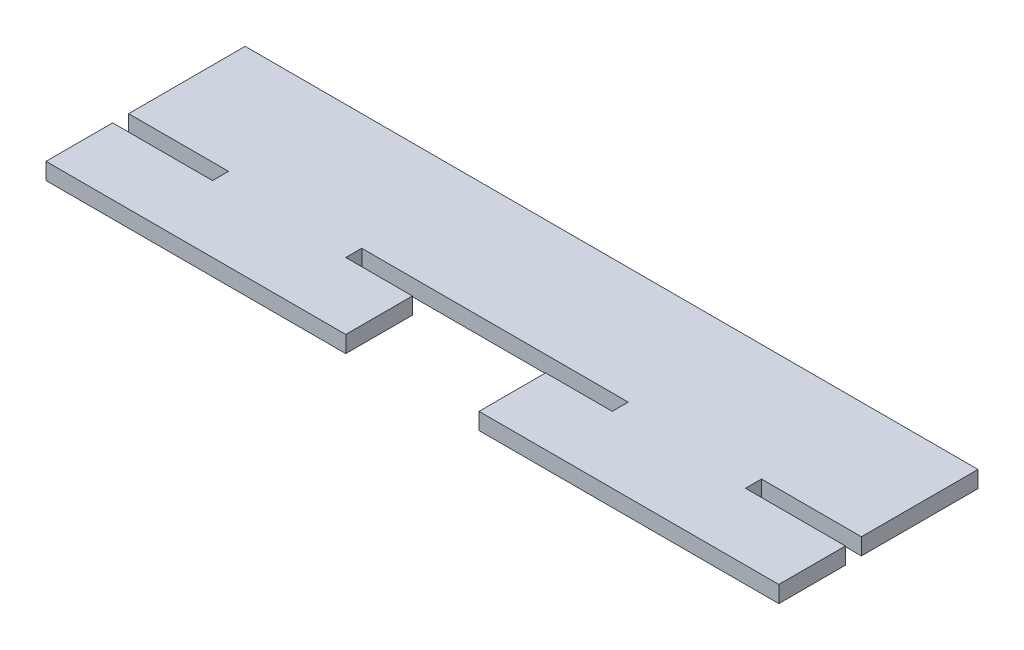
ISO-10303-21;
HEADER;
FILE_DESCRIPTION(('STEP AP214'),'2;1');
FILE_NAME('part.step','',(''),(''),'','','');
FILE_SCHEMA(('AUTOMOTIVE_DESIGN { 1 0 10303 214 1 1 1 1 }'));
ENDSEC;
DATA;
#1=APPLICATION_CONTEXT('core data for automotive mechanical design processes');
#2=APPLICATION_PROTOCOL_DEFINITION('international standard','automotive_design',2000,#1);
#3=PRODUCT_CONTEXT('',#1,'mechanical');
#4=PRODUCT('Part','Part','',(#3));
#5=PRODUCT_RELATED_PRODUCT_CATEGORY('part','',(#4));
#6=PRODUCT_DEFINITION_FORMATION('','',#4);
#7=PRODUCT_DEFINITION_CONTEXT('part definition',#1,'design');
#8=PRODUCT_DEFINITION('design','',#6,#7);
#9=PRODUCT_DEFINITION_SHAPE('','',#8);
#10=(LENGTH_UNIT() NAMED_UNIT(*) SI_UNIT(.MILLI.,.METRE.));
#11=(NAMED_UNIT(*) PLANE_ANGLE_UNIT() SI_UNIT($,.RADIAN.));
#12=(NAMED_UNIT(*) SI_UNIT($,.STERADIAN.) SOLID_ANGLE_UNIT());
#13=UNCERTAINTY_MEASURE_WITH_UNIT(LENGTH_MEASURE(1.E-05),#10,'distance_accuracy_value','');
#14=(GEOMETRIC_REPRESENTATION_CONTEXT(3) GLOBAL_UNCERTAINTY_ASSIGNED_CONTEXT((#13)) GLOBAL_UNIT_ASSIGNED_CONTEXT((#10,
#11,#12)) REPRESENTATION_CONTEXT('',''));
#15=CARTESIAN_POINT('',(0.,0.,0.));
#16=DIRECTION('',(0.,0.,1.));
#17=DIRECTION('',(1.,0.,0.));
#18=AXIS2_PLACEMENT_3D('',#15,#16,#17);
#19=CARTESIAN_POINT('',(-69.85,3.175,0.));
#20=DIRECTION('',(1.,0.,0.));
#21=DIRECTION('',(0.,0.,-1.));
#22=AXIS2_PLACEMENT_3D('',#19,#20,#21);
#23=PLANE('',#22);
#24=DIRECTION('',(0.,0.,1.));
#25=VECTOR('',#24,1.);
#26=CARTESIAN_POINT('',(-69.85,0.,0.));
#27=LINE('',#26,#25);
#28=CARTESIAN_POINT('',(-69.85,0.,-22.225));
#29=VERTEX_POINT('',#28);
#30=CARTESIAN_POINT('',(-69.85,0.,0.));
#31=VERTEX_POINT('',#30);
#32=EDGE_CURVE('E203',#29,#31,#27,.T.);
#33=ORIENTED_EDGE('',*,*,#32,.T.);
#34=DIRECTION('',(0.,-1.,0.));
#35=VECTOR('',#34,1.);
#36=CARTESIAN_POINT('',(-69.85,3.175,0.));
#37=LINE('',#36,#35);
#38=CARTESIAN_POINT('',(-69.85,3.175,0.));
#39=VERTEX_POINT('',#38);
#40=EDGE_CURVE('E11',#39,#31,#37,.T.);
#41=ORIENTED_EDGE('',*,*,#40,.F.);
#42=DIRECTION('',(0.,0.,1.));
#43=VECTOR('',#42,1.);
#44=CARTESIAN_POINT('',(-69.85,3.175,0.));
#45=LINE('',#44,#43);
#46=CARTESIAN_POINT('',(-69.85,3.175,-22.225));
#47=VERTEX_POINT('',#46);
#48=EDGE_CURVE('E241',#47,#39,#45,.T.);
#49=ORIENTED_EDGE('',*,*,#48,.F.);
#50=DIRECTION('',(0.,-1.,0.));
#51=VECTOR('',#50,1.);
#52=CARTESIAN_POINT('',(-69.85,3.175,-22.225));
#53=LINE('',#52,#51);
#54=EDGE_CURVE('E199',#47,#29,#53,.T.);
#55=ORIENTED_EDGE('',*,*,#54,.T.);
#56=EDGE_LOOP('',(#33,#41,#49,#55));
#57=FACE_BOUND('',#56,.T.);
#58=ADVANCED_FACE('F35',(#57),#23,.F.);
#59=CARTESIAN_POINT('',(-50.8,3.175,0.));
#60=DIRECTION('',(0.,0.,-1.));
#61=DIRECTION('',(-1.,0.,0.));
#62=AXIS2_PLACEMENT_3D('',#59,#60,#61);
#63=PLANE('',#62);
#64=DIRECTION('',(1.,0.,0.));
#65=VECTOR('',#64,1.);
#66=CARTESIAN_POINT('',(-50.8,0.,0.));
#67=LINE('',#66,#65);
#68=CARTESIAN_POINT('',(-50.8,0.,0.));
#69=VERTEX_POINT('',#68);
#70=EDGE_CURVE('E206',#31,#69,#67,.T.);
#71=ORIENTED_EDGE('',*,*,#70,.T.);
#72=DIRECTION('',(0.,-1.,0.));
#73=VECTOR('',#72,1.);
#74=CARTESIAN_POINT('',(-50.8,3.175,0.));
#75=LINE('',#74,#73);
#76=CARTESIAN_POINT('',(-50.8,3.175,0.));
#77=VERTEX_POINT('',#76);
#78=EDGE_CURVE('E43',#77,#69,#75,.T.);
#79=ORIENTED_EDGE('',*,*,#78,.F.);
#80=DIRECTION('',(1.,0.,0.));
#81=VECTOR('',#80,1.);
#82=CARTESIAN_POINT('',(-50.8,3.175,0.));
#83=LINE('',#82,#81);
#84=EDGE_CURVE('E130',#39,#77,#83,.T.);
#85=ORIENTED_EDGE('',*,*,#84,.F.);
#86=ORIENTED_EDGE('',*,*,#40,.T.);
#87=EDGE_LOOP('',(#71,#79,#85,#86));
#88=FACE_BOUND('',#87,.T.);
#89=ADVANCED_FACE('F359',(#88),#63,.F.);
#90=CARTESIAN_POINT('',(-50.8,3.175,3.04800000000001));
#91=DIRECTION('',(1.,0.,0.));
#92=DIRECTION('',(0.,0.,-1.));
#93=AXIS2_PLACEMENT_3D('',#90,#91,#92);
#94=PLANE('',#93);
#95=DIRECTION('',(0.,0.,1.));
#96=VECTOR('',#95,1.);
#97=CARTESIAN_POINT('',(-50.8,0.,3.04800000000001));
#98=LINE('',#97,#96);
#99=CARTESIAN_POINT('',(-50.8,0.,3.04800000000001));
#100=VERTEX_POINT('',#99);
#101=EDGE_CURVE('E208',#69,#100,#98,.T.);
#102=ORIENTED_EDGE('',*,*,#101,.T.);
#103=DIRECTION('',(0.,-1.,0.));
#104=VECTOR('',#103,1.);
#105=CARTESIAN_POINT('',(-50.8,3.175,3.04800000000001));
#106=LINE('',#105,#104);
#107=CARTESIAN_POINT('',(-50.8,3.175,3.04800000000001));
#108=VERTEX_POINT('',#107);
#109=EDGE_CURVE('E284',#108,#100,#106,.T.);
#110=ORIENTED_EDGE('',*,*,#109,.F.);
#111=DIRECTION('',(0.,0.,1.));
#112=VECTOR('',#111,1.);
#113=CARTESIAN_POINT('',(-50.8,3.175,3.04800000000001));
#114=LINE('',#113,#112);
#115=EDGE_CURVE('E292',#77,#108,#114,.T.);
#116=ORIENTED_EDGE('',*,*,#115,.F.);
#117=ORIENTED_EDGE('',*,*,#78,.T.);
#118=EDGE_LOOP('',(#102,#110,#116,#117));
#119=FACE_BOUND('',#118,.T.);
#120=ADVANCED_FACE('F290',(#119),#94,.F.);
#121=CARTESIAN_POINT('',(-50.8,3.175,3.04800000000001));
#122=DIRECTION('',(0.,0.,1.));
#123=DIRECTION('',(1.,0.,0.));
#124=AXIS2_PLACEMENT_3D('',#121,#122,#123);
#125=PLANE('',#124);
#126=DIRECTION('',(-1.,0.,0.));
#127=VECTOR('',#126,1.);
#128=CARTESIAN_POINT('',(-50.8,0.,3.04800000000001));
#129=LINE('',#128,#127);
#130=CARTESIAN_POINT('',(-69.85,0.,3.04800000000001));
#131=VERTEX_POINT('',#130);
#132=EDGE_CURVE('E210',#100,#131,#129,.T.);
#133=ORIENTED_EDGE('',*,*,#132,.T.);
#134=DIRECTION('',(0.,-1.,0.));
#135=VECTOR('',#134,1.);
#136=CARTESIAN_POINT('',(-69.85,3.175,3.04800000000001));
#137=LINE('',#136,#135);
#138=CARTESIAN_POINT('',(-69.85,3.175,3.04800000000001));
#139=VERTEX_POINT('',#138);
#140=EDGE_CURVE('E281',#139,#131,#137,.T.);
#141=ORIENTED_EDGE('',*,*,#140,.F.);
#142=DIRECTION('',(-1.,0.,0.));
#143=VECTOR('',#142,1.);
#144=CARTESIAN_POINT('',(-50.8,3.175,3.04800000000001));
#145=LINE('',#144,#143);
#146=EDGE_CURVE('E310',#108,#139,#145,.T.);
#147=ORIENTED_EDGE('',*,*,#146,.F.);
#148=ORIENTED_EDGE('',*,*,#109,.T.);
#149=EDGE_LOOP('',(#133,#141,#147,#148));
#150=FACE_BOUND('',#149,.T.);
#151=ADVANCED_FACE('F301',(#150),#125,.F.);
#152=CARTESIAN_POINT('',(-69.85,3.175,3.04800000000001));
#153=DIRECTION('',(1.,0.,0.));
#154=DIRECTION('',(0.,0.,-1.));
#155=AXIS2_PLACEMENT_3D('',#152,#153,#154);
#156=PLANE('',#155);
#157=DIRECTION('',(0.,0.,1.));
#158=VECTOR('',#157,1.);
#159=CARTESIAN_POINT('',(-69.85,0.,3.04800000000001));
#160=LINE('',#159,#158);
#161=CARTESIAN_POINT('',(-69.85,0.,15.748));
#162=VERTEX_POINT('',#161);
#163=EDGE_CURVE('E212',#131,#162,#160,.T.);
#164=ORIENTED_EDGE('',*,*,#163,.T.);
#165=DIRECTION('',(0.,-1.,0.));
#166=VECTOR('',#165,1.);
#167=CARTESIAN_POINT('',(-69.85,3.175,15.748));
#168=LINE('',#167,#166);
#169=CARTESIAN_POINT('',(-69.85,3.175,15.748));
#170=VERTEX_POINT('',#169);
#171=EDGE_CURVE('E278',#170,#162,#168,.T.);
#172=ORIENTED_EDGE('',*,*,#171,.F.);
#173=DIRECTION('',(0.,0.,1.));
#174=VECTOR('',#173,1.);
#175=CARTESIAN_POINT('',(-69.85,3.175,3.04800000000001));
#176=LINE('',#175,#174);
#177=EDGE_CURVE('E307',#139,#170,#176,.T.);
#178=ORIENTED_EDGE('',*,*,#177,.F.);
#179=ORIENTED_EDGE('',*,*,#140,.T.);
#180=EDGE_LOOP('',(#164,#172,#178,#179));
#181=FACE_BOUND('',#180,.T.);
#182=ADVANCED_FACE('F305',(#181),#156,.F.);
#183=CARTESIAN_POINT('',(-69.85,3.175,15.748));
#184=DIRECTION('',(0.,0.,-1.));
#185=DIRECTION('',(-1.,0.,0.));
#186=AXIS2_PLACEMENT_3D('',#183,#184,#185);
#187=PLANE('',#186);
#188=DIRECTION('',(1.,0.,0.));
#189=VECTOR('',#188,1.);
#190=CARTESIAN_POINT('',(-69.85,0.,15.748));
#191=LINE('',#190,#189);
#192=CARTESIAN_POINT('',(-12.7,0.,15.748));
#193=VERTEX_POINT('',#192);
#194=EDGE_CURVE('E214',#162,#193,#191,.T.);
#195=ORIENTED_EDGE('',*,*,#194,.T.);
#196=DIRECTION('',(0.,-1.,0.));
#197=VECTOR('',#196,1.);
#198=CARTESIAN_POINT('',(-12.7,3.175,15.748));
#199=LINE('',#198,#197);
#200=CARTESIAN_POINT('',(-12.7,3.175,15.748));
#201=VERTEX_POINT('',#200);
#202=EDGE_CURVE('E275',#201,#193,#199,.T.);
#203=ORIENTED_EDGE('',*,*,#202,.F.);
#204=DIRECTION('',(1.,0.,0.));
#205=VECTOR('',#204,1.);
#206=CARTESIAN_POINT('',(-69.85,3.175,15.748));
#207=LINE('',#206,#205);
#208=EDGE_CURVE('E309',#170,#201,#207,.T.);
#209=ORIENTED_EDGE('',*,*,#208,.F.);
#210=ORIENTED_EDGE('',*,*,#171,.T.);
#211=EDGE_LOOP('',(#195,#203,#209,#210));
#212=FACE_BOUND('',#211,.T.);
#213=ADVANCED_FACE('F372',(#212),#187,.F.);
#214=CARTESIAN_POINT('',(-12.7,3.175,15.748));
#215=DIRECTION('',(-1.,0.,0.));
#216=DIRECTION('',(0.,0.,1.));
#217=AXIS2_PLACEMENT_3D('',#214,#215,#216);
#218=PLANE('',#217);
#219=DIRECTION('',(0.,0.,-1.));
#220=VECTOR('',#219,1.);
#221=CARTESIAN_POINT('',(-12.7,0.,15.748));
#222=LINE('',#221,#220);
#223=CARTESIAN_POINT('',(-12.7,0.,3.048));
#224=VERTEX_POINT('',#223);
#225=EDGE_CURVE('E216',#193,#224,#222,.T.);
#226=ORIENTED_EDGE('',*,*,#225,.T.);
#227=DIRECTION('',(0.,-1.,0.));
#228=VECTOR('',#227,1.);
#229=CARTESIAN_POINT('',(-12.7,3.175,3.048));
#230=LINE('',#229,#228);
#231=CARTESIAN_POINT('',(-12.7,3.175,3.048));
#232=VERTEX_POINT('',#231);
#233=EDGE_CURVE('E272',#232,#224,#230,.T.);
#234=ORIENTED_EDGE('',*,*,#233,.F.);
#235=DIRECTION('',(0.,0.,-1.));
#236=VECTOR('',#235,1.);
#237=CARTESIAN_POINT('',(-12.7,3.175,15.748));
#238=LINE('',#237,#236);
#239=EDGE_CURVE('E312',#201,#232,#238,.T.);
#240=ORIENTED_EDGE('',*,*,#239,.F.);
#241=ORIENTED_EDGE('',*,*,#202,.T.);
#242=EDGE_LOOP('',(#226,#234,#240,#241));
#243=FACE_BOUND('',#242,.T.);
#244=ADVANCED_FACE('F375',(#243),#218,.F.);
#245=CARTESIAN_POINT('',(-12.7,3.175,3.048));
#246=DIRECTION('',(0.,0.,1.));
#247=DIRECTION('',(1.,0.,0.));
#248=AXIS2_PLACEMENT_3D('',#245,#246,#247);
#249=PLANE('',#248);
#250=DIRECTION('',(-1.,0.,0.));
#251=VECTOR('',#250,1.);
#252=CARTESIAN_POINT('',(-12.7,0.,3.048));
#253=LINE('',#252,#251);
#254=CARTESIAN_POINT('',(-25.4,0.,3.048));
#255=VERTEX_POINT('',#254);
#256=EDGE_CURVE('E218',#224,#255,#253,.T.);
#257=ORIENTED_EDGE('',*,*,#256,.T.);
#258=DIRECTION('',(0.,-1.,0.));
#259=VECTOR('',#258,1.);
#260=CARTESIAN_POINT('',(-25.4,3.175,3.048));
#261=LINE('',#260,#259);
#262=CARTESIAN_POINT('',(-25.4,3.175,3.048));
#263=VERTEX_POINT('',#262);
#264=EDGE_CURVE('E269',#263,#255,#261,.T.);
#265=ORIENTED_EDGE('',*,*,#264,.F.);
#266=DIRECTION('',(-1.,0.,0.));
#267=VECTOR('',#266,1.);
#268=CARTESIAN_POINT('',(-12.7,3.175,3.048));
#269=LINE('',#268,#267);
#270=EDGE_CURVE('E318',#232,#263,#269,.T.);
#271=ORIENTED_EDGE('',*,*,#270,.F.);
#272=ORIENTED_EDGE('',*,*,#233,.T.);
#273=EDGE_LOOP('',(#257,#265,#271,#272));
#274=FACE_BOUND('',#273,.T.);
#275=ADVANCED_FACE('F379',(#274),#249,.F.);
#276=CARTESIAN_POINT('',(-25.4,3.175,0.));
#277=DIRECTION('',(-1.,0.,0.));
#278=DIRECTION('',(0.,0.,1.));
#279=AXIS2_PLACEMENT_3D('',#276,#277,#278);
#280=PLANE('',#279);
#281=DIRECTION('',(0.,0.,-1.));
#282=VECTOR('',#281,1.);
#283=CARTESIAN_POINT('',(-25.4,0.,0.));
#284=LINE('',#283,#282);
#285=CARTESIAN_POINT('',(-25.4,0.,0.));
#286=VERTEX_POINT('',#285);
#287=EDGE_CURVE('E220',#255,#286,#284,.T.);
#288=ORIENTED_EDGE('',*,*,#287,.T.);
#289=DIRECTION('',(0.,-1.,0.));
#290=VECTOR('',#289,1.);
#291=CARTESIAN_POINT('',(-25.4,3.175,0.));
#292=LINE('',#291,#290);
#293=CARTESIAN_POINT('',(-25.4,3.175,0.));
#294=VERTEX_POINT('',#293);
#295=EDGE_CURVE('E266',#294,#286,#292,.T.);
#296=ORIENTED_EDGE('',*,*,#295,.F.);
#297=DIRECTION('',(0.,0.,-1.));
#298=VECTOR('',#297,1.);
#299=CARTESIAN_POINT('',(-25.4,3.175,0.));
#300=LINE('',#299,#298);
#301=EDGE_CURVE('E320',#263,#294,#300,.T.);
#302=ORIENTED_EDGE('',*,*,#301,.F.);
#303=ORIENTED_EDGE('',*,*,#264,.T.);
#304=EDGE_LOOP('',(#288,#296,#302,#303));
#305=FACE_BOUND('',#304,.T.);
#306=ADVANCED_FACE('F383',(#305),#280,.F.);
#307=CARTESIAN_POINT('',(-25.4,3.175,0.));
#308=DIRECTION('',(0.,0.,-1.));
#309=DIRECTION('',(-1.,0.,0.));
#310=AXIS2_PLACEMENT_3D('',#307,#308,#309);
#311=PLANE('',#310);
#312=DIRECTION('',(1.,0.,0.));
#313=VECTOR('',#312,1.);
#314=CARTESIAN_POINT('',(-25.4,0.,0.));
#315=LINE('',#314,#313);
#316=CARTESIAN_POINT('',(25.4,0.,0.));
#317=VERTEX_POINT('',#316);
#318=EDGE_CURVE('E222',#286,#317,#315,.T.);
#319=ORIENTED_EDGE('',*,*,#318,.T.);
#320=DIRECTION('',(0.,-1.,0.));
#321=VECTOR('',#320,1.);
#322=CARTESIAN_POINT('',(25.4,3.175,0.));
#323=LINE('',#322,#321);
#324=CARTESIAN_POINT('',(25.4,3.175,0.));
#325=VERTEX_POINT('',#324);
#326=EDGE_CURVE('E263',#325,#317,#323,.T.);
#327=ORIENTED_EDGE('',*,*,#326,.F.);
#328=DIRECTION('',(1.,0.,0.));
#329=VECTOR('',#328,1.);
#330=CARTESIAN_POINT('',(-25.4,3.175,0.));
#331=LINE('',#330,#329);
#332=EDGE_CURVE('E322',#294,#325,#331,.T.);
#333=ORIENTED_EDGE('',*,*,#332,.F.);
#334=ORIENTED_EDGE('',*,*,#295,.T.);
#335=EDGE_LOOP('',(#319,#327,#333,#334));
#336=FACE_BOUND('',#335,.T.);
#337=ADVANCED_FACE('F387',(#336),#311,.F.);
#338=CARTESIAN_POINT('',(25.4,3.175,0.));
#339=DIRECTION('',(1.,0.,0.));
#340=DIRECTION('',(0.,0.,-1.));
#341=AXIS2_PLACEMENT_3D('',#338,#339,#340);
#342=PLANE('',#341);
#343=DIRECTION('',(0.,0.,1.));
#344=VECTOR('',#343,1.);
#345=CARTESIAN_POINT('',(25.4,0.,0.));
#346=LINE('',#345,#344);
#347=CARTESIAN_POINT('',(25.4,0.,3.048));
#348=VERTEX_POINT('',#347);
#349=EDGE_CURVE('E224',#317,#348,#346,.T.);
#350=ORIENTED_EDGE('',*,*,#349,.T.);
#351=DIRECTION('',(0.,-1.,0.));
#352=VECTOR('',#351,1.);
#353=CARTESIAN_POINT('',(25.4,3.175,3.048));
#354=LINE('',#353,#352);
#355=CARTESIAN_POINT('',(25.4,3.175,3.048));
#356=VERTEX_POINT('',#355);
#357=EDGE_CURVE('E260',#356,#348,#354,.T.);
#358=ORIENTED_EDGE('',*,*,#357,.F.);
#359=DIRECTION('',(0.,0.,1.));
#360=VECTOR('',#359,1.);
#361=CARTESIAN_POINT('',(25.4,3.175,0.));
#362=LINE('',#361,#360);
#363=EDGE_CURVE('E324',#325,#356,#362,.T.);
#364=ORIENTED_EDGE('',*,*,#363,.F.);
#365=ORIENTED_EDGE('',*,*,#326,.T.);
#366=EDGE_LOOP('',(#350,#358,#364,#365));
#367=FACE_BOUND('',#366,.T.);
#368=ADVANCED_FACE('F391',(#367),#342,.F.);
#369=CARTESIAN_POINT('',(25.4,3.175,3.048));
#370=DIRECTION('',(0.,0.,1.));
#371=DIRECTION('',(1.,0.,0.));
#372=AXIS2_PLACEMENT_3D('',#369,#370,#371);
#373=PLANE('',#372);
#374=DIRECTION('',(-1.,0.,0.));
#375=VECTOR('',#374,1.);
#376=CARTESIAN_POINT('',(25.4,0.,3.048));
#377=LINE('',#376,#375);
#378=CARTESIAN_POINT('',(12.7,0.,3.048));
#379=VERTEX_POINT('',#378);
#380=EDGE_CURVE('E226',#348,#379,#377,.T.);
#381=ORIENTED_EDGE('',*,*,#380,.T.);
#382=DIRECTION('',(0.,-1.,0.));
#383=VECTOR('',#382,1.);
#384=CARTESIAN_POINT('',(12.7,3.175,3.048));
#385=LINE('',#384,#383);
#386=CARTESIAN_POINT('',(12.7,3.175,3.048));
#387=VERTEX_POINT('',#386);
#388=EDGE_CURVE('E257',#387,#379,#385,.T.);
#389=ORIENTED_EDGE('',*,*,#388,.F.);
#390=DIRECTION('',(-1.,0.,0.));
#391=VECTOR('',#390,1.);
#392=CARTESIAN_POINT('',(25.4,3.175,3.048));
#393=LINE('',#392,#391);
#394=EDGE_CURVE('E326',#356,#387,#393,.T.);
#395=ORIENTED_EDGE('',*,*,#394,.F.);
#396=ORIENTED_EDGE('',*,*,#357,.T.);
#397=EDGE_LOOP('',(#381,#389,#395,#396));
#398=FACE_BOUND('',#397,.T.);
#399=ADVANCED_FACE('F395',(#398),#373,.F.);
#400=CARTESIAN_POINT('',(12.7,3.175,3.048));
#401=DIRECTION('',(1.,0.,0.));
#402=DIRECTION('',(0.,0.,-1.));
#403=AXIS2_PLACEMENT_3D('',#400,#401,#402);
#404=PLANE('',#403);
#405=DIRECTION('',(0.,0.,1.));
#406=VECTOR('',#405,1.);
#407=CARTESIAN_POINT('',(12.7,0.,3.048));
#408=LINE('',#407,#406);
#409=CARTESIAN_POINT('',(12.7,0.,15.748));
#410=VERTEX_POINT('',#409);
#411=EDGE_CURVE('E228',#379,#410,#408,.T.);
#412=ORIENTED_EDGE('',*,*,#411,.T.);
#413=DIRECTION('',(0.,-1.,0.));
#414=VECTOR('',#413,1.);
#415=CARTESIAN_POINT('',(12.7,3.175,15.748));
#416=LINE('',#415,#414);
#417=CARTESIAN_POINT('',(12.7,3.175,15.748));
#418=VERTEX_POINT('',#417);
#419=EDGE_CURVE('E254',#418,#410,#416,.T.);
#420=ORIENTED_EDGE('',*,*,#419,.F.);
#421=DIRECTION('',(0.,0.,1.));
#422=VECTOR('',#421,1.);
#423=CARTESIAN_POINT('',(12.7,3.175,3.048));
#424=LINE('',#423,#422);
#425=EDGE_CURVE('E328',#387,#418,#424,.T.);
#426=ORIENTED_EDGE('',*,*,#425,.F.);
#427=ORIENTED_EDGE('',*,*,#388,.T.);
#428=EDGE_LOOP('',(#412,#420,#426,#427));
#429=FACE_BOUND('',#428,.T.);
#430=ADVANCED_FACE('F399',(#429),#404,.F.);
#431=CARTESIAN_POINT('',(12.7,3.175,15.748));
#432=DIRECTION('',(0.,0.,-1.));
#433=DIRECTION('',(-1.,0.,0.));
#434=AXIS2_PLACEMENT_3D('',#431,#432,#433);
#435=PLANE('',#434);
#436=DIRECTION('',(1.,0.,0.));
#437=VECTOR('',#436,1.);
#438=CARTESIAN_POINT('',(12.7,0.,15.748));
#439=LINE('',#438,#437);
#440=CARTESIAN_POINT('',(69.85,0.,15.748));
#441=VERTEX_POINT('',#440);
#442=EDGE_CURVE('E230',#410,#441,#439,.T.);
#443=ORIENTED_EDGE('',*,*,#442,.T.);
#444=DIRECTION('',(0.,-1.,0.));
#445=VECTOR('',#444,1.);
#446=CARTESIAN_POINT('',(69.85,3.175,15.748));
#447=LINE('',#446,#445);
#448=CARTESIAN_POINT('',(69.85,3.175,15.748));
#449=VERTEX_POINT('',#448);
#450=EDGE_CURVE('E251',#449,#441,#447,.T.);
#451=ORIENTED_EDGE('',*,*,#450,.F.);
#452=DIRECTION('',(1.,0.,0.));
#453=VECTOR('',#452,1.);
#454=CARTESIAN_POINT('',(12.7,3.175,15.748));
#455=LINE('',#454,#453);
#456=EDGE_CURVE('E330',#418,#449,#455,.T.);
#457=ORIENTED_EDGE('',*,*,#456,.F.);
#458=ORIENTED_EDGE('',*,*,#419,.T.);
#459=EDGE_LOOP('',(#443,#451,#457,#458));
#460=FACE_BOUND('',#459,.T.);
#461=ADVANCED_FACE('F403',(#460),#435,.F.);
#462=CARTESIAN_POINT('',(69.85,3.175,15.748));
#463=DIRECTION('',(-1.,0.,0.));
#464=DIRECTION('',(0.,0.,1.));
#465=AXIS2_PLACEMENT_3D('',#462,#463,#464);
#466=PLANE('',#465);
#467=DIRECTION('',(0.,0.,-1.));
#468=VECTOR('',#467,1.);
#469=CARTESIAN_POINT('',(69.85,0.,15.748));
#470=LINE('',#469,#468);
#471=CARTESIAN_POINT('',(69.85,0.,3.04799999999999));
#472=VERTEX_POINT('',#471);
#473=EDGE_CURVE('E232',#441,#472,#470,.T.);
#474=ORIENTED_EDGE('',*,*,#473,.T.);
#475=DIRECTION('',(0.,-1.,0.));
#476=VECTOR('',#475,1.);
#477=CARTESIAN_POINT('',(69.85,3.175,3.04799999999999));
#478=LINE('',#477,#476);
#479=CARTESIAN_POINT('',(69.85,3.175,3.04799999999999));
#480=VERTEX_POINT('',#479);
#481=EDGE_CURVE('E248',#480,#472,#478,.T.);
#482=ORIENTED_EDGE('',*,*,#481,.F.);
#483=DIRECTION('',(0.,0.,-1.));
#484=VECTOR('',#483,1.);
#485=CARTESIAN_POINT('',(69.85,3.175,15.748));
#486=LINE('',#485,#484);
#487=EDGE_CURVE('E332',#449,#480,#486,.T.);
#488=ORIENTED_EDGE('',*,*,#487,.F.);
#489=ORIENTED_EDGE('',*,*,#450,.T.);
#490=EDGE_LOOP('',(#474,#482,#488,#489));
#491=FACE_BOUND('',#490,.T.);
#492=ADVANCED_FACE('F407',(#491),#466,.F.);
#493=CARTESIAN_POINT('',(69.85,3.175,3.04799999999999));
#494=DIRECTION('',(0.,0.,1.));
#495=DIRECTION('',(1.,0.,0.));
#496=AXIS2_PLACEMENT_3D('',#493,#494,#495);
#497=PLANE('',#496);
#498=DIRECTION('',(-1.,0.,0.));
#499=VECTOR('',#498,1.);
#500=CARTESIAN_POINT('',(69.85,0.,3.04799999999999));
#501=LINE('',#500,#499);
#502=CARTESIAN_POINT('',(50.8,0.,3.04800000000001));
#503=VERTEX_POINT('',#502);
#504=EDGE_CURVE('E234',#472,#503,#501,.T.);
#505=ORIENTED_EDGE('',*,*,#504,.T.);
#506=DIRECTION('',(0.,-1.,0.));
#507=VECTOR('',#506,1.);
#508=CARTESIAN_POINT('',(50.8,3.175,3.04800000000001));
#509=LINE('',#508,#507);
#510=CARTESIAN_POINT('',(50.8,3.175,3.04800000000001));
#511=VERTEX_POINT('',#510);
#512=EDGE_CURVE('E245',#511,#503,#509,.T.);
#513=ORIENTED_EDGE('',*,*,#512,.F.);
#514=DIRECTION('',(-1.,0.,0.));
#515=VECTOR('',#514,1.);
#516=CARTESIAN_POINT('',(69.85,3.175,3.04799999999999));
#517=LINE('',#516,#515);
#518=EDGE_CURVE('E334',#480,#511,#517,.T.);
#519=ORIENTED_EDGE('',*,*,#518,.F.);
#520=ORIENTED_EDGE('',*,*,#481,.T.);
#521=EDGE_LOOP('',(#505,#513,#519,#520));
#522=FACE_BOUND('',#521,.T.);
#523=ADVANCED_FACE('F340',(#522),#497,.F.);
#524=CARTESIAN_POINT('',(50.8,3.175,3.04800000000001));
#525=DIRECTION('',(-1.,0.,0.));
#526=DIRECTION('',(0.,0.,1.));
#527=AXIS2_PLACEMENT_3D('',#524,#525,#526);
#528=PLANE('',#527);
#529=DIRECTION('',(0.,0.,-1.));
#530=VECTOR('',#529,1.);
#531=CARTESIAN_POINT('',(50.8,0.,3.04800000000001));
#532=LINE('',#531,#530);
#533=CARTESIAN_POINT('',(50.8,0.,0.));
#534=VERTEX_POINT('',#533);
#535=EDGE_CURVE('E236',#503,#534,#532,.T.);
#536=ORIENTED_EDGE('',*,*,#535,.T.);
#537=DIRECTION('',(0.,-1.,0.));
#538=VECTOR('',#537,1.);
#539=CARTESIAN_POINT('',(50.8,3.175,0.));
#540=LINE('',#539,#538);
#541=CARTESIAN_POINT('',(50.8,3.175,0.));
#542=VERTEX_POINT('',#541);
#543=EDGE_CURVE('E194',#542,#534,#540,.T.);
#544=ORIENTED_EDGE('',*,*,#543,.F.);
#545=DIRECTION('',(0.,0.,-1.));
#546=VECTOR('',#545,1.);
#547=CARTESIAN_POINT('',(50.8,3.175,3.04800000000001));
#548=LINE('',#547,#546);
#549=EDGE_CURVE('E185',#511,#542,#548,.T.);
#550=ORIENTED_EDGE('',*,*,#549,.F.);
#551=ORIENTED_EDGE('',*,*,#512,.T.);
#552=EDGE_LOOP('',(#536,#544,#550,#551));
#553=FACE_BOUND('',#552,.T.);
#554=ADVANCED_FACE('F344',(#553),#528,.F.);
#555=CARTESIAN_POINT('',(50.8,3.175,0.));
#556=DIRECTION('',(0.,0.,-1.));
#557=DIRECTION('',(-1.,0.,0.));
#558=AXIS2_PLACEMENT_3D('',#555,#556,#557);
#559=PLANE('',#558);
#560=DIRECTION('',(1.,0.,0.));
#561=VECTOR('',#560,1.);
#562=CARTESIAN_POINT('',(50.8,0.,0.));
#563=LINE('',#562,#561);
#564=CARTESIAN_POINT('',(69.85,0.,0.));
#565=VERTEX_POINT('',#564);
#566=EDGE_CURVE('E193',#534,#565,#563,.T.);
#567=ORIENTED_EDGE('',*,*,#566,.T.);
#568=DIRECTION('',(0.,-1.,0.));
#569=VECTOR('',#568,1.);
#570=CARTESIAN_POINT('',(69.85,3.175,0.));
#571=LINE('',#570,#569);
#572=CARTESIAN_POINT('',(69.85,3.175,0.));
#573=VERTEX_POINT('',#572);
#574=EDGE_CURVE('E190',#573,#565,#571,.T.);
#575=ORIENTED_EDGE('',*,*,#574,.F.);
#576=DIRECTION('',(1.,0.,0.));
#577=VECTOR('',#576,1.);
#578=CARTESIAN_POINT('',(50.8,3.175,0.));
#579=LINE('',#578,#577);
#580=EDGE_CURVE('E179',#542,#573,#579,.T.);
#581=ORIENTED_EDGE('',*,*,#580,.F.);
#582=ORIENTED_EDGE('',*,*,#543,.T.);
#583=EDGE_LOOP('',(#567,#575,#581,#582));
#584=FACE_BOUND('',#583,.T.);
#585=ADVANCED_FACE('F191',(#584),#559,.F.);
#586=CARTESIAN_POINT('',(69.85,3.175,0.));
#587=DIRECTION('',(-1.,0.,0.));
#588=DIRECTION('',(0.,0.,1.));
#589=AXIS2_PLACEMENT_3D('',#586,#587,#588);
#590=PLANE('',#589);
#591=DIRECTION('',(0.,0.,-1.));
#592=VECTOR('',#591,1.);
#593=CARTESIAN_POINT('',(69.85,0.,0.));
#594=LINE('',#593,#592);
#595=CARTESIAN_POINT('',(69.85,0.,-22.225));
#596=VERTEX_POINT('',#595);
#597=EDGE_CURVE('E116',#565,#596,#594,.T.);
#598=ORIENTED_EDGE('',*,*,#597,.T.);
#599=DIRECTION('',(0.,-1.,0.));
#600=VECTOR('',#599,1.);
#601=CARTESIAN_POINT('',(69.85,3.175,-22.225));
#602=LINE('',#601,#600);
#603=CARTESIAN_POINT('',(69.85,3.175,-22.225));
#604=VERTEX_POINT('',#603);
#605=EDGE_CURVE('E195',#604,#596,#602,.T.);
#606=ORIENTED_EDGE('',*,*,#605,.F.);
#607=DIRECTION('',(0.,0.,-1.));
#608=VECTOR('',#607,1.);
#609=CARTESIAN_POINT('',(69.85,3.175,0.));
#610=LINE('',#609,#608);
#611=EDGE_CURVE('E183',#573,#604,#610,.T.);
#612=ORIENTED_EDGE('',*,*,#611,.F.);
#613=ORIENTED_EDGE('',*,*,#574,.T.);
#614=EDGE_LOOP('',(#598,#606,#612,#613));
#615=FACE_BOUND('',#614,.T.);
#616=ADVANCED_FACE('F197',(#615),#590,.F.);
#617=CARTESIAN_POINT('',(-69.85,3.175,-22.225));
#618=DIRECTION('',(0.,0.,1.));
#619=DIRECTION('',(1.,0.,0.));
#620=AXIS2_PLACEMENT_3D('',#617,#618,#619);
#621=PLANE('',#620);
#622=DIRECTION('',(-1.,0.,0.));
#623=VECTOR('',#622,1.);
#624=CARTESIAN_POINT('',(-69.85,0.,-22.225));
#625=LINE('',#624,#623);
#626=EDGE_CURVE('E122',#596,#29,#625,.T.);
#627=ORIENTED_EDGE('',*,*,#626,.T.);
#628=ORIENTED_EDGE('',*,*,#54,.F.);
#629=DIRECTION('',(-1.,0.,0.));
#630=VECTOR('',#629,1.);
#631=CARTESIAN_POINT('',(-69.85,3.175,-22.225));
#632=LINE('',#631,#630);
#633=EDGE_CURVE('E51',#604,#47,#632,.T.);
#634=ORIENTED_EDGE('',*,*,#633,.F.);
#635=ORIENTED_EDGE('',*,*,#605,.T.);
#636=EDGE_LOOP('',(#627,#628,#634,#635));
#637=FACE_BOUND('',#636,.T.);
#638=ADVANCED_FACE('F348',(#637),#621,.F.);
#639=CARTESIAN_POINT('',(0.,3.175,0.));
#640=DIRECTION('',(0.,-1.,0.));
#641=DIRECTION('',(0.,0.,-1.));
#642=AXIS2_PLACEMENT_3D('',#639,#640,#641);
#643=PLANE('',#642);
#644=ORIENTED_EDGE('',*,*,#48,.T.);
#645=ORIENTED_EDGE('',*,*,#84,.T.);
#646=ORIENTED_EDGE('',*,*,#115,.T.);
#647=ORIENTED_EDGE('',*,*,#146,.T.);
#648=ORIENTED_EDGE('',*,*,#177,.T.);
#649=ORIENTED_EDGE('',*,*,#208,.T.);
#650=ORIENTED_EDGE('',*,*,#239,.T.);
#651=ORIENTED_EDGE('',*,*,#270,.T.);
#652=ORIENTED_EDGE('',*,*,#301,.T.);
#653=ORIENTED_EDGE('',*,*,#332,.T.);
#654=ORIENTED_EDGE('',*,*,#363,.T.);
#655=ORIENTED_EDGE('',*,*,#394,.T.);
#656=ORIENTED_EDGE('',*,*,#425,.T.);
#657=ORIENTED_EDGE('',*,*,#456,.T.);
#658=ORIENTED_EDGE('',*,*,#487,.T.);
#659=ORIENTED_EDGE('',*,*,#518,.T.);
#660=ORIENTED_EDGE('',*,*,#549,.T.);
#661=ORIENTED_EDGE('',*,*,#580,.T.);
#662=ORIENTED_EDGE('',*,*,#611,.T.);
#663=ORIENTED_EDGE('',*,*,#633,.T.);
#664=EDGE_LOOP('',(#644,#645,#646,#647,#648,#649,#650,#651,#652,#653,#654,#655,#656,#657,#658,
#659,#660,#661,#662,#663));
#665=FACE_BOUND('',#664,.T.);
#666=ADVANCED_FACE('F181',(#665),#643,.F.);
#667=CARTESIAN_POINT('',(0.,0.,0.));
#668=DIRECTION('',(0.,-1.,0.));
#669=DIRECTION('',(0.,0.,-1.));
#670=AXIS2_PLACEMENT_3D('',#667,#668,#669);
#671=PLANE('',#670);
#672=ORIENTED_EDGE('',*,*,#32,.F.);
#673=ORIENTED_EDGE('',*,*,#626,.F.);
#674=ORIENTED_EDGE('',*,*,#597,.F.);
#675=ORIENTED_EDGE('',*,*,#566,.F.);
#676=ORIENTED_EDGE('',*,*,#535,.F.);
#677=ORIENTED_EDGE('',*,*,#504,.F.);
#678=ORIENTED_EDGE('',*,*,#473,.F.);
#679=ORIENTED_EDGE('',*,*,#442,.F.);
#680=ORIENTED_EDGE('',*,*,#411,.F.);
#681=ORIENTED_EDGE('',*,*,#380,.F.);
#682=ORIENTED_EDGE('',*,*,#349,.F.);
#683=ORIENTED_EDGE('',*,*,#318,.F.);
#684=ORIENTED_EDGE('',*,*,#287,.F.);
#685=ORIENTED_EDGE('',*,*,#256,.F.);
#686=ORIENTED_EDGE('',*,*,#225,.F.);
#687=ORIENTED_EDGE('',*,*,#194,.F.);
#688=ORIENTED_EDGE('',*,*,#163,.F.);
#689=ORIENTED_EDGE('',*,*,#132,.F.);
#690=ORIENTED_EDGE('',*,*,#101,.F.);
#691=ORIENTED_EDGE('',*,*,#70,.F.);
#692=EDGE_LOOP('',(#672,#673,#674,#675,#676,#677,#678,#679,#680,#681,#682,#683,#684,#685,#686,
#687,#688,#689,#690,#691));
#693=FACE_BOUND('',#692,.T.);
#694=ADVANCED_FACE('F296',(#693),#671,.T.);
#695=CLOSED_SHELL('',(#58,#89,#120,#151,#182,#213,#244,#275,#306,#337,#368,#399,#430,#461,#492,
#523,#554,#585,#616,#638,#666,#694));
#696=MANIFOLD_SOLID_BREP('B2',#695);
#697=ADVANCED_BREP_SHAPE_REPRESENTATION('',(#18,#696),#14);
#698=SHAPE_DEFINITION_REPRESENTATION(#9,#697);
ENDSEC;
END-ISO-10303-21;
